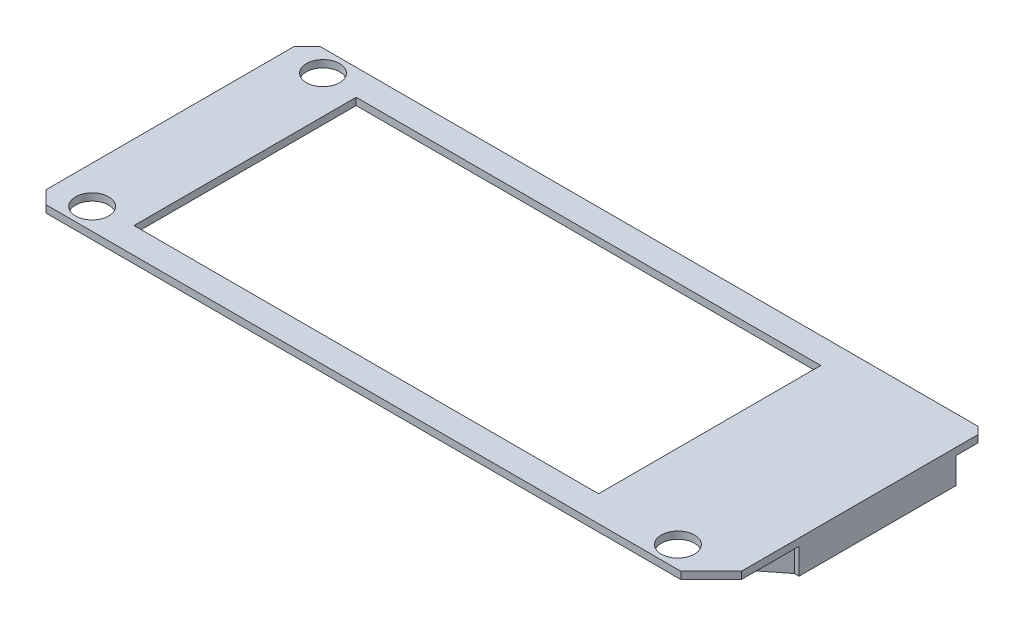
ISO-10303-21;
HEADER;
FILE_DESCRIPTION(('STEP AP214'),'2;1');
FILE_NAME('part.step','',(''),(''),'','','');
FILE_SCHEMA(('AUTOMOTIVE_DESIGN { 1 0 10303 214 1 1 1 1 }'));
ENDSEC;
DATA;
#1=APPLICATION_CONTEXT('core data for automotive mechanical design processes');
#2=APPLICATION_PROTOCOL_DEFINITION('international standard','automotive_design',2000,#1);
#3=PRODUCT_CONTEXT('',#1,'mechanical');
#4=PRODUCT('Part','Part','',(#3));
#5=PRODUCT_RELATED_PRODUCT_CATEGORY('part','',(#4));
#6=PRODUCT_DEFINITION_FORMATION('','',#4);
#7=PRODUCT_DEFINITION_CONTEXT('part definition',#1,'design');
#8=PRODUCT_DEFINITION('design','',#6,#7);
#9=PRODUCT_DEFINITION_SHAPE('','',#8);
#10=(LENGTH_UNIT() NAMED_UNIT(*) SI_UNIT(.MILLI.,.METRE.));
#11=(NAMED_UNIT(*) PLANE_ANGLE_UNIT() SI_UNIT($,.RADIAN.));
#12=(NAMED_UNIT(*) SI_UNIT($,.STERADIAN.) SOLID_ANGLE_UNIT());
#13=UNCERTAINTY_MEASURE_WITH_UNIT(LENGTH_MEASURE(1.E-05),#10,'distance_accuracy_value','');
#14=(GEOMETRIC_REPRESENTATION_CONTEXT(3) GLOBAL_UNCERTAINTY_ASSIGNED_CONTEXT((#13)) GLOBAL_UNIT_ASSIGNED_CONTEXT((#10,
#11,#12)) REPRESENTATION_CONTEXT('',''));
#15=CARTESIAN_POINT('',(0.,0.,0.));
#16=DIRECTION('',(0.,0.,1.));
#17=DIRECTION('',(1.,0.,0.));
#18=AXIS2_PLACEMENT_3D('',#15,#16,#17);
#19=CARTESIAN_POINT('',(17.3158649017874,0.,-2.33980702383453));
#20=DIRECTION('',(0.,1.,0.));
#21=DIRECTION('',(0.,0.,1.));
#22=AXIS2_PLACEMENT_3D('',#19,#20,#21);
#23=PLANE('',#22);
#24=CARTESIAN_POINT('',(-21.0841350982126,0.,-8.3398070238345));
#25=DIRECTION('',(0.,1.,0.));
#26=DIRECTION('',(0.,0.,1.));
#27=AXIS2_PLACEMENT_3D('',#24,#25,#26);
#28=CIRCLE('',#27,1.15);
#29=CARTESIAN_POINT('',(-21.0841350982126,0.,-7.18980702383451));
#30=VERTEX_POINT('',#29);
#31=EDGE_CURVE('E469',#30,#30,#28,.T.);
#32=ORIENTED_EDGE('',*,*,#31,.T.);
#33=EDGE_LOOP('',(#32));
#34=FACE_BOUND('',#33,.T.);
#35=CARTESIAN_POINT('',(-21.0841350982126,0.,7.6601929761655));
#36=DIRECTION('',(0.,1.,0.));
#37=DIRECTION('',(0.,0.,1.));
#38=AXIS2_PLACEMENT_3D('',#35,#36,#37);
#39=CIRCLE('',#38,1.15);
#40=CARTESIAN_POINT('',(-21.0841350982126,0.,8.8101929761655));
#41=VERTEX_POINT('',#40);
#42=EDGE_CURVE('E660',#41,#41,#39,.T.);
#43=ORIENTED_EDGE('',*,*,#42,.T.);
#44=EDGE_LOOP('',(#43));
#45=FACE_BOUND('',#44,.T.);
#46=CARTESIAN_POINT('',(19.5158649017874,0.,7.6601929761655));
#47=DIRECTION('',(0.,1.,0.));
#48=DIRECTION('',(0.,0.,1.));
#49=AXIS2_PLACEMENT_3D('',#46,#47,#48);
#50=CIRCLE('',#49,1.15);
#51=CARTESIAN_POINT('',(19.5158649017874,0.,8.8101929761655));
#52=VERTEX_POINT('',#51);
#53=EDGE_CURVE('E664',#52,#52,#50,.T.);
#54=ORIENTED_EDGE('',*,*,#53,.T.);
#55=EDGE_LOOP('',(#54));
#56=FACE_BOUND('',#55,.T.);
#57=DIRECTION('',(0.,0.,1.));
#58=VECTOR('',#57,1.);
#59=CARTESIAN_POINT('',(-18.4841350982126,0.,-8.0398070238345));
#60=LINE('',#59,#58);
#61=CARTESIAN_POINT('',(-18.4841350982126,0.,-8.0398070238345));
#62=VERTEX_POINT('',#61);
#63=CARTESIAN_POINT('',(-18.4841350982126,0.,7.36019297616549));
#64=VERTEX_POINT('',#63);
#65=EDGE_CURVE('E271',#62,#64,#60,.T.);
#66=ORIENTED_EDGE('',*,*,#65,.T.);
#67=DIRECTION('',(-1.,0.,0.));
#68=VECTOR('',#67,1.);
#69=CARTESIAN_POINT('',(0.,0.,7.36019297616549));
#70=LINE('',#69,#68);
#71=CARTESIAN_POINT('',(13.7158649017874,0.,7.36019297616549));
#72=VERTEX_POINT('',#71);
#73=EDGE_CURVE('E296',#72,#64,#70,.T.);
#74=ORIENTED_EDGE('',*,*,#73,.F.);
#75=DIRECTION('',(0.,0.,-1.));
#76=VECTOR('',#75,1.);
#77=CARTESIAN_POINT('',(13.7158649017874,0.,0.));
#78=LINE('',#77,#76);
#79=CARTESIAN_POINT('',(13.7158649017874,0.,-8.0398070238345));
#80=VERTEX_POINT('',#79);
#81=EDGE_CURVE('E300',#72,#80,#78,.T.);
#82=ORIENTED_EDGE('',*,*,#81,.T.);
#83=DIRECTION('',(-1.,0.,0.));
#84=VECTOR('',#83,1.);
#85=CARTESIAN_POINT('',(0.,0.,-8.0398070238345));
#86=LINE('',#85,#84);
#87=EDGE_CURVE('E287',#80,#62,#86,.T.);
#88=ORIENTED_EDGE('',*,*,#87,.T.);
#89=EDGE_LOOP('',(#66,#74,#82,#88));
#90=FACE_BOUND('',#89,.T.);
#91=DIRECTION('',(-1.,0.,0.));
#92=VECTOR('',#91,1.);
#93=CARTESIAN_POINT('',(23.3158649017874,0.,3.06205646756993));
#94=LINE('',#93,#92);
#95=CARTESIAN_POINT('',(23.3158649017874,0.,3.06205646756993));
#96=VERTEX_POINT('',#95);
#97=CARTESIAN_POINT('',(22.9996878692031,0.,3.06205646756993));
#98=VERTEX_POINT('',#97);
#99=EDGE_CURVE('E432',#96,#98,#94,.T.);
#100=ORIENTED_EDGE('',*,*,#99,.F.);
#101=DIRECTION('',(0.,0.,-1.));
#102=VECTOR('',#101,1.);
#103=CARTESIAN_POINT('',(23.3158649017874,0.,-7.9398070238345));
#104=LINE('',#103,#102);
#105=CARTESIAN_POINT('',(23.3158649017874,0.,7.0601929761655));
#106=VERTEX_POINT('',#105);
#107=EDGE_CURVE('E327',#106,#96,#104,.T.);
#108=ORIENTED_EDGE('',*,*,#107,.F.);
#109=DIRECTION('',(0.707106781186547,0.,-0.707106781186548));
#110=VECTOR('',#109,1.);
#111=CARTESIAN_POINT('',(21.2158649017874,0.,9.16019297616549));
#112=LINE('',#111,#110);
#113=CARTESIAN_POINT('',(21.2158649017874,0.,9.16019297616549));
#114=VERTEX_POINT('',#113);
#115=EDGE_CURVE('E367',#114,#106,#112,.T.);
#116=ORIENTED_EDGE('',*,*,#115,.F.);
#117=DIRECTION('',(1.,0.,0.));
#118=VECTOR('',#117,1.);
#119=CARTESIAN_POINT('',(-22.7841350982126,0.,9.16019297616549));
#120=LINE('',#119,#118);
#121=CARTESIAN_POINT('',(-22.7841350982126,0.,9.16019297616549));
#122=VERTEX_POINT('',#121);
#123=EDGE_CURVE('E364',#122,#114,#120,.T.);
#124=ORIENTED_EDGE('',*,*,#123,.F.);
#125=DIRECTION('',(0.707106781186549,0.,0.707106781186546));
#126=VECTOR('',#125,1.);
#127=CARTESIAN_POINT('',(-23.6841350982126,0.,8.2601929761655));
#128=LINE('',#127,#126);
#129=CARTESIAN_POINT('',(-23.6841350982126,0.,8.2601929761655));
#130=VERTEX_POINT('',#129);
#131=EDGE_CURVE('E361',#130,#122,#128,.T.);
#132=ORIENTED_EDGE('',*,*,#131,.F.);
#133=DIRECTION('',(0.,0.,1.));
#134=VECTOR('',#133,1.);
#135=CARTESIAN_POINT('',(-23.6841350982126,0.,-8.9398070238345));
#136=LINE('',#135,#134);
#137=CARTESIAN_POINT('',(-23.6841350982126,0.,-8.9398070238345));
#138=VERTEX_POINT('',#137);
#139=EDGE_CURVE('E358',#138,#130,#136,.T.);
#140=ORIENTED_EDGE('',*,*,#139,.F.);
#141=DIRECTION('',(-0.707106781186549,0.,0.707106781186545));
#142=VECTOR('',#141,1.);
#143=CARTESIAN_POINT('',(-22.7841350982126,0.,-9.8398070238345));
#144=LINE('',#143,#142);
#145=CARTESIAN_POINT('',(-22.7841350982126,0.,-9.8398070238345));
#146=VERTEX_POINT('',#145);
#147=EDGE_CURVE('E355',#146,#138,#144,.T.);
#148=ORIENTED_EDGE('',*,*,#147,.F.);
#149=DIRECTION('',(-1.,0.,0.));
#150=VECTOR('',#149,1.);
#151=CARTESIAN_POINT('',(22.8158649017874,0.,-9.83980702383451));
#152=LINE('',#151,#150);
#153=CARTESIAN_POINT('',(22.8158649017874,0.,-9.83980702383451));
#154=VERTEX_POINT('',#153);
#155=EDGE_CURVE('E352',#154,#146,#152,.T.);
#156=ORIENTED_EDGE('',*,*,#155,.F.);
#157=DIRECTION('',(-0.707106781186539,0.,-0.707106781186556));
#158=VECTOR('',#157,1.);
#159=CARTESIAN_POINT('',(23.3158649017874,0.,-9.3398070238345));
#160=LINE('',#159,#158);
#161=CARTESIAN_POINT('',(23.3158649017874,0.,-9.3398070238345));
#162=VERTEX_POINT('',#161);
#163=EDGE_CURVE('E318',#162,#154,#160,.T.);
#164=ORIENTED_EDGE('',*,*,#163,.F.);
#165=CARTESIAN_POINT('',(23.3158649017874,0.,-7.82183285091469));
#166=VERTEX_POINT('',#165);
#167=EDGE_CURVE('E371',#166,#162,#104,.T.);
#168=ORIENTED_EDGE('',*,*,#167,.F.);
#169=DIRECTION('',(1.,0.,0.));
#170=VECTOR('',#169,1.);
#171=CARTESIAN_POINT('',(22.9524615456008,0.,-7.82183285091469));
#172=LINE('',#171,#170);
#173=CARTESIAN_POINT('',(22.9524615456008,0.,-7.82183285091469));
#174=VERTEX_POINT('',#173);
#175=EDGE_CURVE('E428',#174,#166,#172,.T.);
#176=ORIENTED_EDGE('',*,*,#175,.F.);
#177=DIRECTION('',(0.771886501575493,0.,0.635760354760776));
#178=VECTOR('',#177,1.);
#179=CARTESIAN_POINT('',(21.5301264029284,0.,-8.99333189002014));
#180=LINE('',#179,#178);
#181=CARTESIAN_POINT('',(21.5301264029284,0.,-8.99333189002014));
#182=VERTEX_POINT('',#181);
#183=EDGE_CURVE('E269',#182,#174,#180,.T.);
#184=ORIENTED_EDGE('',*,*,#183,.F.);
#185=DIRECTION('',(1.,0.,0.));
#186=VECTOR('',#185,1.);
#187=CARTESIAN_POINT('',(19.7180205816291,0.,-8.99333189002014));
#188=LINE('',#187,#186);
#189=CARTESIAN_POINT('',(19.7180205816291,0.,-8.99333189002014));
#190=VERTEX_POINT('',#189);
#191=EDGE_CURVE('E266',#190,#182,#188,.T.);
#192=ORIENTED_EDGE('',*,*,#191,.F.);
#193=DIRECTION('',(0.,0.,-1.));
#194=VECTOR('',#193,1.);
#195=CARTESIAN_POINT('',(19.7180205816291,0.,4.42459913742816));
#196=LINE('',#195,#194);
#197=CARTESIAN_POINT('',(19.7180205816291,0.,4.42459913742816));
#198=VERTEX_POINT('',#197);
#199=EDGE_CURVE('E493',#198,#190,#196,.T.);
#200=ORIENTED_EDGE('',*,*,#199,.F.);
#201=DIRECTION('',(-1.,0.,0.));
#202=VECTOR('',#201,1.);
#203=CARTESIAN_POINT('',(20.0307736130758,0.,4.42459913742816));
#204=LINE('',#203,#202);
#205=CARTESIAN_POINT('',(20.0307736130758,0.,4.42459913742816));
#206=VERTEX_POINT('',#205);
#207=EDGE_CURVE('E489',#206,#198,#204,.T.);
#208=ORIENTED_EDGE('',*,*,#207,.F.);
#209=DIRECTION('',(0.,0.,-1.));
#210=VECTOR('',#209,1.);
#211=CARTESIAN_POINT('',(20.0307736130758,0.,5.41628734671873));
#212=LINE('',#211,#210);
#213=CARTESIAN_POINT('',(20.0307736130758,0.,5.41628734671873));
#214=VERTEX_POINT('',#213);
#215=EDGE_CURVE('E485',#214,#206,#212,.T.);
#216=ORIENTED_EDGE('',*,*,#215,.F.);
#217=DIRECTION('',(-1.,0.,0.));
#218=VECTOR('',#217,1.);
#219=CARTESIAN_POINT('',(21.0247582431746,0.,5.41628734671873));
#220=LINE('',#219,#218);
#221=CARTESIAN_POINT('',(21.0247582431746,0.,5.41628734671873));
#222=VERTEX_POINT('',#221);
#223=EDGE_CURVE('E481',#222,#214,#220,.T.);
#224=ORIENTED_EDGE('',*,*,#223,.F.);
#225=DIRECTION('',(0.,0.,1.));
#226=VECTOR('',#225,1.);
#227=CARTESIAN_POINT('',(21.0247582431746,0.,4.42459913742816));
#228=LINE('',#227,#226);
#229=CARTESIAN_POINT('',(21.0247582431746,0.,4.42459913742816));
#230=VERTEX_POINT('',#229);
#231=EDGE_CURVE('E477',#230,#222,#228,.T.);
#232=ORIENTED_EDGE('',*,*,#231,.F.);
#233=DIRECTION('',(-1.,0.,0.));
#234=VECTOR('',#233,1.);
#235=CARTESIAN_POINT('',(21.2615809906494,0.,4.42459913742816));
#236=LINE('',#235,#234);
#237=CARTESIAN_POINT('',(21.2615809906494,0.,4.42459913742816));
#238=VERTEX_POINT('',#237);
#239=EDGE_CURVE('E104',#238,#230,#236,.T.);
#240=ORIENTED_EDGE('',*,*,#239,.F.);
#241=DIRECTION('',(-0.787002560515835,0.,0.616949730319675));
#242=VECTOR('',#241,1.);
#243=CARTESIAN_POINT('',(22.9996878692031,0.,3.06205646756993));
#244=LINE('',#243,#242);
#245=EDGE_CURVE('E99',#98,#238,#244,.T.);
#246=ORIENTED_EDGE('',*,*,#245,.F.);
#247=EDGE_LOOP('',(#100,#108,#116,#124,#132,#140,#148,#156,#164,#168,#176,#184,#192,#200,#208,
#216,#224,#232,#240,#246));
#248=FACE_BOUND('',#247,.T.);
#249=ADVANCED_FACE('F83',(#34,#45,#56,#90,#248),#23,.F.);
#250=CARTESIAN_POINT('',(17.3158649017874,0.5,-2.33980702383453));
#251=DIRECTION('',(0.,1.,0.));
#252=DIRECTION('',(0.,0.,1.));
#253=AXIS2_PLACEMENT_3D('',#250,#251,#252);
#254=PLANE('',#253);
#255=CARTESIAN_POINT('',(-21.0841350982126,0.5,-8.3398070238345));
#256=DIRECTION('',(0.,1.,0.));
#257=DIRECTION('',(0.,0.,1.));
#258=AXIS2_PLACEMENT_3D('',#255,#256,#257);
#259=CIRCLE('',#258,1.15);
#260=CARTESIAN_POINT('',(-21.0841350982126,0.5,-7.18980702383451));
#261=VERTEX_POINT('',#260);
#262=EDGE_CURVE('E657',#261,#261,#259,.T.);
#263=ORIENTED_EDGE('',*,*,#262,.F.);
#264=EDGE_LOOP('',(#263));
#265=FACE_BOUND('',#264,.T.);
#266=CARTESIAN_POINT('',(-21.0841350982126,0.5,7.6601929761655));
#267=DIRECTION('',(0.,1.,0.));
#268=DIRECTION('',(0.,0.,1.));
#269=AXIS2_PLACEMENT_3D('',#266,#267,#268);
#270=CIRCLE('',#269,1.15);
#271=CARTESIAN_POINT('',(-21.0841350982126,0.5,8.8101929761655));
#272=VERTEX_POINT('',#271);
#273=EDGE_CURVE('E674',#272,#272,#270,.T.);
#274=ORIENTED_EDGE('',*,*,#273,.F.);
#275=EDGE_LOOP('',(#274));
#276=FACE_BOUND('',#275,.T.);
#277=CARTESIAN_POINT('',(19.5158649017874,0.5,7.6601929761655));
#278=DIRECTION('',(0.,1.,0.));
#279=DIRECTION('',(0.,0.,1.));
#280=AXIS2_PLACEMENT_3D('',#277,#278,#279);
#281=CIRCLE('',#280,1.15);
#282=CARTESIAN_POINT('',(19.5158649017874,0.5,8.8101929761655));
#283=VERTEX_POINT('',#282);
#284=EDGE_CURVE('E670',#283,#283,#281,.T.);
#285=ORIENTED_EDGE('',*,*,#284,.F.);
#286=EDGE_LOOP('',(#285));
#287=FACE_BOUND('',#286,.T.);
#288=DIRECTION('',(0.707106781186547,0.,-0.707106781186548));
#289=VECTOR('',#288,1.);
#290=CARTESIAN_POINT('',(21.2158649017874,0.5,9.16019297616549));
#291=LINE('',#290,#289);
#292=CARTESIAN_POINT('',(21.2158649017874,0.5,9.16019297616549));
#293=VERTEX_POINT('',#292);
#294=CARTESIAN_POINT('',(23.3158649017874,0.5,7.0601929761655));
#295=VERTEX_POINT('',#294);
#296=EDGE_CURVE('E342',#293,#295,#291,.T.);
#297=ORIENTED_EDGE('',*,*,#296,.T.);
#298=DIRECTION('',(0.,0.,-1.));
#299=VECTOR('',#298,1.);
#300=CARTESIAN_POINT('',(23.3158649017874,0.5,7.0601929761655));
#301=LINE('',#300,#299);
#302=CARTESIAN_POINT('',(23.3158649017874,0.5,-9.3398070238345));
#303=VERTEX_POINT('',#302);
#304=EDGE_CURVE('E345',#295,#303,#301,.T.);
#305=ORIENTED_EDGE('',*,*,#304,.T.);
#306=DIRECTION('',(-0.707106781186539,0.,-0.707106781186556));
#307=VECTOR('',#306,1.);
#308=CARTESIAN_POINT('',(23.3158649017874,0.5,-9.3398070238345));
#309=LINE('',#308,#307);
#310=CARTESIAN_POINT('',(22.8158649017874,0.5,-9.83980702383451));
#311=VERTEX_POINT('',#310);
#312=EDGE_CURVE('E322',#303,#311,#309,.T.);
#313=ORIENTED_EDGE('',*,*,#312,.T.);
#314=DIRECTION('',(-1.,0.,0.));
#315=VECTOR('',#314,1.);
#316=CARTESIAN_POINT('',(22.8158649017874,0.5,-9.83980702383451));
#317=LINE('',#316,#315);
#318=CARTESIAN_POINT('',(-22.7841350982126,0.5,-9.8398070238345));
#319=VERTEX_POINT('',#318);
#320=EDGE_CURVE('E326',#311,#319,#317,.T.);
#321=ORIENTED_EDGE('',*,*,#320,.T.);
#322=DIRECTION('',(-0.707106781186549,0.,0.707106781186545));
#323=VECTOR('',#322,1.);
#324=CARTESIAN_POINT('',(-22.7841350982126,0.5,-9.8398070238345));
#325=LINE('',#324,#323);
#326=CARTESIAN_POINT('',(-23.6841350982126,0.5,-8.9398070238345));
#327=VERTEX_POINT('',#326);
#328=EDGE_CURVE('E330',#319,#327,#325,.T.);
#329=ORIENTED_EDGE('',*,*,#328,.T.);
#330=DIRECTION('',(0.,0.,1.));
#331=VECTOR('',#330,1.);
#332=CARTESIAN_POINT('',(-23.6841350982126,0.5,-8.9398070238345));
#333=LINE('',#332,#331);
#334=CARTESIAN_POINT('',(-23.6841350982126,0.5,8.2601929761655));
#335=VERTEX_POINT('',#334);
#336=EDGE_CURVE('E333',#327,#335,#333,.T.);
#337=ORIENTED_EDGE('',*,*,#336,.T.);
#338=DIRECTION('',(0.707106781186549,0.,0.707106781186546));
#339=VECTOR('',#338,1.);
#340=CARTESIAN_POINT('',(-23.6841350982126,0.5,8.2601929761655));
#341=LINE('',#340,#339);
#342=CARTESIAN_POINT('',(-22.7841350982126,0.5,9.16019297616549));
#343=VERTEX_POINT('',#342);
#344=EDGE_CURVE('E336',#335,#343,#341,.T.);
#345=ORIENTED_EDGE('',*,*,#344,.T.);
#346=DIRECTION('',(1.,0.,0.));
#347=VECTOR('',#346,1.);
#348=CARTESIAN_POINT('',(-22.7841350982126,0.5,9.16019297616549));
#349=LINE('',#348,#347);
#350=EDGE_CURVE('E339',#343,#293,#349,.T.);
#351=ORIENTED_EDGE('',*,*,#350,.T.);
#352=EDGE_LOOP('',(#297,#305,#313,#321,#329,#337,#345,#351));
#353=FACE_BOUND('',#352,.T.);
#354=DIRECTION('',(-1.,0.,0.));
#355=VECTOR('',#354,1.);
#356=CARTESIAN_POINT('',(0.,0.5,7.36019297616549));
#357=LINE('',#356,#355);
#358=CARTESIAN_POINT('',(13.7158649017874,0.5,7.36019297616549));
#359=VERTEX_POINT('',#358);
#360=CARTESIAN_POINT('',(-18.4841350982126,0.5,7.36019297616549));
#361=VERTEX_POINT('',#360);
#362=EDGE_CURVE('E282',#359,#361,#357,.T.);
#363=ORIENTED_EDGE('',*,*,#362,.T.);
#364=DIRECTION('',(0.,0.,1.));
#365=VECTOR('',#364,1.);
#366=CARTESIAN_POINT('',(-18.4841350982126,0.5,-8.0398070238345));
#367=LINE('',#366,#365);
#368=CARTESIAN_POINT('',(-18.4841350982126,0.5,-8.0398070238345));
#369=VERTEX_POINT('',#368);
#370=EDGE_CURVE('E276',#369,#361,#367,.T.);
#371=ORIENTED_EDGE('',*,*,#370,.F.);
#372=DIRECTION('',(-1.,0.,0.));
#373=VECTOR('',#372,1.);
#374=CARTESIAN_POINT('',(0.,0.5,-8.0398070238345));
#375=LINE('',#374,#373);
#376=CARTESIAN_POINT('',(13.7158649017874,0.5,-8.0398070238345));
#377=VERTEX_POINT('',#376);
#378=EDGE_CURVE('E291',#377,#369,#375,.T.);
#379=ORIENTED_EDGE('',*,*,#378,.F.);
#380=DIRECTION('',(0.,0.,-1.));
#381=VECTOR('',#380,1.);
#382=CARTESIAN_POINT('',(13.7158649017874,0.5,0.));
#383=LINE('',#382,#381);
#384=EDGE_CURVE('E286',#359,#377,#383,.T.);
#385=ORIENTED_EDGE('',*,*,#384,.F.);
#386=EDGE_LOOP('',(#363,#371,#379,#385));
#387=FACE_BOUND('',#386,.T.);
#388=ADVANCED_FACE('F420',(#265,#276,#287,#353,#387),#254,.T.);
#389=CARTESIAN_POINT('',(23.3158649017874,0.5,-9.3398070238345));
#390=DIRECTION('',(-0.707106781186556,0.,0.707106781186539));
#391=DIRECTION('',(0.707106781186539,0.,0.707106781186556));
#392=AXIS2_PLACEMENT_3D('',#389,#390,#391);
#393=PLANE('',#392);
#394=ORIENTED_EDGE('',*,*,#163,.T.);
#395=DIRECTION('',(0.,-1.,0.));
#396=VECTOR('',#395,1.);
#397=CARTESIAN_POINT('',(22.8158649017874,0.5,-9.83980702383451));
#398=LINE('',#397,#396);
#399=EDGE_CURVE('E12',#311,#154,#398,.T.);
#400=ORIENTED_EDGE('',*,*,#399,.F.);
#401=ORIENTED_EDGE('',*,*,#312,.F.);
#402=DIRECTION('',(0.,-1.,0.));
#403=VECTOR('',#402,1.);
#404=CARTESIAN_POINT('',(23.3158649017874,0.5,-9.3398070238345));
#405=LINE('',#404,#403);
#406=EDGE_CURVE('E348',#303,#162,#405,.T.);
#407=ORIENTED_EDGE('',*,*,#406,.T.);
#408=EDGE_LOOP('',(#394,#400,#401,#407));
#409=FACE_BOUND('',#408,.T.);
#410=ADVANCED_FACE('F85',(#409),#393,.F.);
#411=CARTESIAN_POINT('',(22.8158649017874,0.5,-9.83980702383451));
#412=DIRECTION('',(0.,0.,1.));
#413=DIRECTION('',(1.,0.,0.));
#414=AXIS2_PLACEMENT_3D('',#411,#412,#413);
#415=PLANE('',#414);
#416=DIRECTION('',(0.,-1.,0.));
#417=VECTOR('',#416,1.);
#418=CARTESIAN_POINT('',(-22.7841350982126,0.5,-9.8398070238345));
#419=LINE('',#418,#417);
#420=EDGE_CURVE('E92',#319,#146,#419,.T.);
#421=ORIENTED_EDGE('',*,*,#420,.F.);
#422=ORIENTED_EDGE('',*,*,#320,.F.);
#423=ORIENTED_EDGE('',*,*,#399,.T.);
#424=ORIENTED_EDGE('',*,*,#155,.T.);
#425=EDGE_LOOP('',(#421,#422,#423,#424));
#426=FACE_BOUND('',#425,.T.);
#427=ADVANCED_FACE('F425',(#426),#415,.F.);
#428=CARTESIAN_POINT('',(-22.7841350982126,0.5,-9.8398070238345));
#429=DIRECTION('',(0.707106781186546,0.,0.70710678118655));
#430=DIRECTION('',(0.70710678118655,0.,-0.707106781186546));
#431=AXIS2_PLACEMENT_3D('',#428,#429,#430);
#432=PLANE('',#431);
#433=ORIENTED_EDGE('',*,*,#147,.T.);
#434=DIRECTION('',(0.,-1.,0.));
#435=VECTOR('',#434,1.);
#436=CARTESIAN_POINT('',(-23.6841350982126,0.5,-8.9398070238345));
#437=LINE('',#436,#435);
#438=EDGE_CURVE('E394',#327,#138,#437,.T.);
#439=ORIENTED_EDGE('',*,*,#438,.F.);
#440=ORIENTED_EDGE('',*,*,#328,.F.);
#441=ORIENTED_EDGE('',*,*,#420,.T.);
#442=EDGE_LOOP('',(#433,#439,#440,#441));
#443=FACE_BOUND('',#442,.T.);
#444=ADVANCED_FACE('F403',(#443),#432,.F.);
#445=CARTESIAN_POINT('',(-23.6841350982126,0.5,-8.9398070238345));
#446=DIRECTION('',(1.,0.,0.));
#447=DIRECTION('',(0.,0.,-1.));
#448=AXIS2_PLACEMENT_3D('',#445,#446,#447);
#449=PLANE('',#448);
#450=ORIENTED_EDGE('',*,*,#139,.T.);
#451=DIRECTION('',(0.,-1.,0.));
#452=VECTOR('',#451,1.);
#453=CARTESIAN_POINT('',(-23.6841350982126,0.5,8.2601929761655));
#454=LINE('',#453,#452);
#455=EDGE_CURVE('E390',#335,#130,#454,.T.);
#456=ORIENTED_EDGE('',*,*,#455,.F.);
#457=ORIENTED_EDGE('',*,*,#336,.F.);
#458=ORIENTED_EDGE('',*,*,#438,.T.);
#459=EDGE_LOOP('',(#450,#456,#457,#458));
#460=FACE_BOUND('',#459,.T.);
#461=ADVANCED_FACE('F412',(#460),#449,.F.);
#462=CARTESIAN_POINT('',(-23.6841350982126,0.5,8.2601929761655));
#463=DIRECTION('',(0.707106781186546,0.,-0.707106781186549));
#464=DIRECTION('',(-0.707106781186549,0.,-0.707106781186546));
#465=AXIS2_PLACEMENT_3D('',#462,#463,#464);
#466=PLANE('',#465);
#467=ORIENTED_EDGE('',*,*,#131,.T.);
#468=DIRECTION('',(0.,-1.,0.));
#469=VECTOR('',#468,1.);
#470=CARTESIAN_POINT('',(-22.7841350982126,0.5,9.16019297616549));
#471=LINE('',#470,#469);
#472=EDGE_CURVE('E386',#343,#122,#471,.T.);
#473=ORIENTED_EDGE('',*,*,#472,.F.);
#474=ORIENTED_EDGE('',*,*,#344,.F.);
#475=ORIENTED_EDGE('',*,*,#455,.T.);
#476=EDGE_LOOP('',(#467,#473,#474,#475));
#477=FACE_BOUND('',#476,.T.);
#478=ADVANCED_FACE('F416',(#477),#466,.F.);
#479=CARTESIAN_POINT('',(-22.7841350982126,0.5,9.16019297616549));
#480=DIRECTION('',(0.,0.,-1.));
#481=DIRECTION('',(-1.,0.,0.));
#482=AXIS2_PLACEMENT_3D('',#479,#480,#481);
#483=PLANE('',#482);
#484=ORIENTED_EDGE('',*,*,#123,.T.);
#485=DIRECTION('',(0.,-1.,0.));
#486=VECTOR('',#485,1.);
#487=CARTESIAN_POINT('',(21.2158649017874,0.5,9.16019297616549));
#488=LINE('',#487,#486);
#489=EDGE_CURVE('E382',#293,#114,#488,.T.);
#490=ORIENTED_EDGE('',*,*,#489,.F.);
#491=ORIENTED_EDGE('',*,*,#350,.F.);
#492=ORIENTED_EDGE('',*,*,#472,.T.);
#493=EDGE_LOOP('',(#484,#490,#491,#492));
#494=FACE_BOUND('',#493,.T.);
#495=ADVANCED_FACE('F594',(#494),#483,.F.);
#496=CARTESIAN_POINT('',(21.2158649017874,0.5,9.16019297616549));
#497=DIRECTION('',(-0.707106781186548,0.,-0.707106781186547));
#498=DIRECTION('',(-0.707106781186547,0.,0.707106781186548));
#499=AXIS2_PLACEMENT_3D('',#496,#497,#498);
#500=PLANE('',#499);
#501=ORIENTED_EDGE('',*,*,#115,.T.);
#502=DIRECTION('',(0.,-1.,0.));
#503=VECTOR('',#502,1.);
#504=CARTESIAN_POINT('',(23.3158649017874,0.5,7.0601929761655));
#505=LINE('',#504,#503);
#506=EDGE_CURVE('E378',#295,#106,#505,.T.);
#507=ORIENTED_EDGE('',*,*,#506,.F.);
#508=ORIENTED_EDGE('',*,*,#296,.F.);
#509=ORIENTED_EDGE('',*,*,#489,.T.);
#510=EDGE_LOOP('',(#501,#507,#508,#509));
#511=FACE_BOUND('',#510,.T.);
#512=ADVANCED_FACE('F591',(#511),#500,.F.);
#513=CARTESIAN_POINT('',(23.3158649017874,0.5,-7.9398070238345));
#514=DIRECTION('',(-1.,0.,0.));
#515=DIRECTION('',(0.,0.,1.));
#516=AXIS2_PLACEMENT_3D('',#513,#514,#515);
#517=PLANE('',#516);
#518=ORIENTED_EDGE('',*,*,#107,.T.);
#519=DIRECTION('',(0.,1.,0.));
#520=VECTOR('',#519,1.);
#521=CARTESIAN_POINT('',(23.3158649017874,-1.8,3.06205646756993));
#522=LINE('',#521,#520);
#523=CARTESIAN_POINT('',(23.3158649017874,-1.8,3.06205646756993));
#524=VERTEX_POINT('',#523);
#525=EDGE_CURVE('E278',#524,#96,#522,.T.);
#526=ORIENTED_EDGE('',*,*,#525,.F.);
#527=DIRECTION('',(0.,0.,1.));
#528=VECTOR('',#527,1.);
#529=CARTESIAN_POINT('',(23.3158649017874,-1.8,-7.82183285091469));
#530=LINE('',#529,#528);
#531=CARTESIAN_POINT('',(23.3158649017874,-1.8,-7.82183285091469));
#532=VERTEX_POINT('',#531);
#533=EDGE_CURVE('E255',#532,#524,#530,.T.);
#534=ORIENTED_EDGE('',*,*,#533,.F.);
#535=DIRECTION('',(0.,1.,0.));
#536=VECTOR('',#535,1.);
#537=CARTESIAN_POINT('',(23.3158649017874,-1.8,-7.82183285091469));
#538=LINE('',#537,#536);
#539=EDGE_CURVE('E251',#532,#166,#538,.T.);
#540=ORIENTED_EDGE('',*,*,#539,.T.);
#541=ORIENTED_EDGE('',*,*,#167,.T.);
#542=ORIENTED_EDGE('',*,*,#406,.F.);
#543=ORIENTED_EDGE('',*,*,#304,.F.);
#544=ORIENTED_EDGE('',*,*,#506,.T.);
#545=EDGE_LOOP('',(#518,#526,#534,#540,#541,#542,#543,#544));
#546=FACE_BOUND('',#545,.T.);
#547=ADVANCED_FACE('F434',(#546),#517,.F.);
#548=CARTESIAN_POINT('',(0.,0.5,-8.0398070238345));
#549=DIRECTION('',(0.,0.,1.));
#550=DIRECTION('',(1.,0.,0.));
#551=AXIS2_PLACEMENT_3D('',#548,#549,#550);
#552=PLANE('',#551);
#553=DIRECTION('',(0.,1.,0.));
#554=VECTOR('',#553,1.);
#555=CARTESIAN_POINT('',(-18.4841350982126,0.5,-8.0398070238345));
#556=LINE('',#555,#554);
#557=EDGE_CURVE('E310',#62,#369,#556,.T.);
#558=ORIENTED_EDGE('',*,*,#557,.F.);
#559=ORIENTED_EDGE('',*,*,#87,.F.);
#560=DIRECTION('',(0.,-1.,0.));
#561=VECTOR('',#560,1.);
#562=CARTESIAN_POINT('',(13.7158649017874,0.5,-8.0398070238345));
#563=LINE('',#562,#561);
#564=EDGE_CURVE('E307',#377,#80,#563,.T.);
#565=ORIENTED_EDGE('',*,*,#564,.F.);
#566=ORIENTED_EDGE('',*,*,#378,.T.);
#567=EDGE_LOOP('',(#558,#559,#565,#566));
#568=FACE_BOUND('',#567,.T.);
#569=ADVANCED_FACE('F590',(#568),#552,.T.);
#570=CARTESIAN_POINT('',(13.7158649017874,0.5,0.));
#571=DIRECTION('',(-1.,0.,0.));
#572=DIRECTION('',(0.,0.,1.));
#573=AXIS2_PLACEMENT_3D('',#570,#571,#572);
#574=PLANE('',#573);
#575=ORIENTED_EDGE('',*,*,#81,.F.);
#576=DIRECTION('',(0.,-1.,0.));
#577=VECTOR('',#576,1.);
#578=CARTESIAN_POINT('',(13.7158649017874,0.5,7.36019297616549));
#579=LINE('',#578,#577);
#580=EDGE_CURVE('E311',#359,#72,#579,.T.);
#581=ORIENTED_EDGE('',*,*,#580,.F.);
#582=ORIENTED_EDGE('',*,*,#384,.T.);
#583=ORIENTED_EDGE('',*,*,#564,.T.);
#584=EDGE_LOOP('',(#575,#581,#582,#583));
#585=FACE_BOUND('',#584,.T.);
#586=ADVANCED_FACE('F698',(#585),#574,.T.);
#587=CARTESIAN_POINT('',(0.,0.5,7.36019297616549));
#588=DIRECTION('',(0.,0.,1.));
#589=DIRECTION('',(1.,0.,0.));
#590=AXIS2_PLACEMENT_3D('',#587,#588,#589);
#591=PLANE('',#590);
#592=ORIENTED_EDGE('',*,*,#73,.T.);
#593=DIRECTION('',(0.,-1.,0.));
#594=VECTOR('',#593,1.);
#595=CARTESIAN_POINT('',(-18.4841350982126,0.5,7.36019297616549));
#596=LINE('',#595,#594);
#597=EDGE_CURVE('E295',#361,#64,#596,.T.);
#598=ORIENTED_EDGE('',*,*,#597,.F.);
#599=ORIENTED_EDGE('',*,*,#362,.F.);
#600=ORIENTED_EDGE('',*,*,#580,.T.);
#601=EDGE_LOOP('',(#592,#598,#599,#600));
#602=FACE_BOUND('',#601,.T.);
#603=ADVANCED_FACE('F694',(#602),#591,.F.);
#604=CARTESIAN_POINT('',(-18.4841350982126,0.5,-8.0398070238345));
#605=DIRECTION('',(1.,0.,0.));
#606=DIRECTION('',(0.,0.,-1.));
#607=AXIS2_PLACEMENT_3D('',#604,#605,#606);
#608=PLANE('',#607);
#609=ORIENTED_EDGE('',*,*,#597,.T.);
#610=ORIENTED_EDGE('',*,*,#65,.F.);
#611=ORIENTED_EDGE('',*,*,#557,.T.);
#612=ORIENTED_EDGE('',*,*,#370,.T.);
#613=EDGE_LOOP('',(#609,#610,#611,#612));
#614=FACE_BOUND('',#613,.T.);
#615=ADVANCED_FACE('F702',(#614),#608,.T.);
#616=CARTESIAN_POINT('',(21.5301264029284,-1.8,-8.99333189002014));
#617=DIRECTION('',(-0.635760354760776,0.,0.771886501575493));
#618=DIRECTION('',(0.771886501575493,0.,0.635760354760776));
#619=AXIS2_PLACEMENT_3D('',#616,#617,#618);
#620=PLANE('',#619);
#621=ORIENTED_EDGE('',*,*,#183,.T.);
#622=DIRECTION('',(0.,1.,0.));
#623=VECTOR('',#622,1.);
#624=CARTESIAN_POINT('',(22.9524615456008,-1.8,-7.82183285091469));
#625=LINE('',#624,#623);
#626=CARTESIAN_POINT('',(22.9524615456008,-1.8,-7.82183285091469));
#627=VERTEX_POINT('',#626);
#628=EDGE_CURVE('E248',#627,#174,#625,.T.);
#629=ORIENTED_EDGE('',*,*,#628,.F.);
#630=DIRECTION('',(0.771886501575493,0.,0.635760354760776));
#631=VECTOR('',#630,1.);
#632=CARTESIAN_POINT('',(21.5301264029284,-1.8,-8.99333189002014));
#633=LINE('',#632,#631);
#634=CARTESIAN_POINT('',(21.5301264029284,-1.8,-8.99333189002014));
#635=VERTEX_POINT('',#634);
#636=EDGE_CURVE('E256',#635,#627,#633,.T.);
#637=ORIENTED_EDGE('',*,*,#636,.F.);
#638=DIRECTION('',(0.,1.,0.));
#639=VECTOR('',#638,1.);
#640=CARTESIAN_POINT('',(21.5301264029284,-1.8,-8.99333189002014));
#641=LINE('',#640,#639);
#642=EDGE_CURVE('E467',#635,#182,#641,.T.);
#643=ORIENTED_EDGE('',*,*,#642,.T.);
#644=EDGE_LOOP('',(#621,#629,#637,#643));
#645=FACE_BOUND('',#644,.T.);
#646=ADVANCED_FACE('F268',(#645),#620,.F.);
#647=CARTESIAN_POINT('',(22.9524615456008,-1.8,-7.82183285091469));
#648=DIRECTION('',(0.,0.,1.));
#649=DIRECTION('',(1.,0.,0.));
#650=AXIS2_PLACEMENT_3D('',#647,#648,#649);
#651=PLANE('',#650);
#652=ORIENTED_EDGE('',*,*,#175,.T.);
#653=ORIENTED_EDGE('',*,*,#539,.F.);
#654=DIRECTION('',(1.,0.,0.));
#655=VECTOR('',#654,1.);
#656=CARTESIAN_POINT('',(22.9524615456008,-1.8,-7.82183285091469));
#657=LINE('',#656,#655);
#658=EDGE_CURVE('E243',#627,#532,#657,.T.);
#659=ORIENTED_EDGE('',*,*,#658,.F.);
#660=ORIENTED_EDGE('',*,*,#628,.T.);
#661=EDGE_LOOP('',(#652,#653,#659,#660));
#662=FACE_BOUND('',#661,.T.);
#663=ADVANCED_FACE('F246',(#662),#651,.F.);
#664=CARTESIAN_POINT('',(23.3158649017874,-1.8,3.06205646756993));
#665=DIRECTION('',(0.,0.,-1.));
#666=DIRECTION('',(-1.,0.,0.));
#667=AXIS2_PLACEMENT_3D('',#664,#665,#666);
#668=PLANE('',#667);
#669=ORIENTED_EDGE('',*,*,#99,.T.);
#670=DIRECTION('',(0.,1.,0.));
#671=VECTOR('',#670,1.);
#672=CARTESIAN_POINT('',(22.9996878692031,-1.8,3.06205646756993));
#673=LINE('',#672,#671);
#674=CARTESIAN_POINT('',(22.9996878692031,-1.8,3.06205646756993));
#675=VERTEX_POINT('',#674);
#676=EDGE_CURVE('E530',#675,#98,#673,.T.);
#677=ORIENTED_EDGE('',*,*,#676,.F.);
#678=DIRECTION('',(-1.,0.,0.));
#679=VECTOR('',#678,1.);
#680=CARTESIAN_POINT('',(23.3158649017874,-1.8,3.06205646756993));
#681=LINE('',#680,#679);
#682=EDGE_CURVE('E439',#524,#675,#681,.T.);
#683=ORIENTED_EDGE('',*,*,#682,.F.);
#684=ORIENTED_EDGE('',*,*,#525,.T.);
#685=EDGE_LOOP('',(#669,#677,#683,#684));
#686=FACE_BOUND('',#685,.T.);
#687=ADVANCED_FACE('F535',(#686),#668,.F.);
#688=CARTESIAN_POINT('',(22.9996878692031,-1.8,3.06205646756993));
#689=DIRECTION('',(-0.616949730319675,0.,-0.787002560515835));
#690=DIRECTION('',(-0.787002560515835,0.,0.616949730319675));
#691=AXIS2_PLACEMENT_3D('',#688,#689,#690);
#692=PLANE('',#691);
#693=ORIENTED_EDGE('',*,*,#245,.T.);
#694=DIRECTION('',(0.,1.,0.));
#695=VECTOR('',#694,1.);
#696=CARTESIAN_POINT('',(21.2615809906494,-1.8,4.42459913742816));
#697=LINE('',#696,#695);
#698=CARTESIAN_POINT('',(21.2615809906494,-1.8,4.42459913742816));
#699=VERTEX_POINT('',#698);
#700=EDGE_CURVE('E526',#699,#238,#697,.T.);
#701=ORIENTED_EDGE('',*,*,#700,.F.);
#702=DIRECTION('',(-0.787002560515835,0.,0.616949730319675));
#703=VECTOR('',#702,1.);
#704=CARTESIAN_POINT('',(22.9996878692031,-1.8,3.06205646756993));
#705=LINE('',#704,#703);
#706=EDGE_CURVE('E442',#675,#699,#705,.T.);
#707=ORIENTED_EDGE('',*,*,#706,.F.);
#708=ORIENTED_EDGE('',*,*,#676,.T.);
#709=EDGE_LOOP('',(#693,#701,#707,#708));
#710=FACE_BOUND('',#709,.T.);
#711=ADVANCED_FACE('F542',(#710),#692,.F.);
#712=CARTESIAN_POINT('',(21.2615809906494,-1.8,4.42459913742816));
#713=DIRECTION('',(0.,0.,-1.));
#714=DIRECTION('',(-1.,0.,0.));
#715=AXIS2_PLACEMENT_3D('',#712,#713,#714);
#716=PLANE('',#715);
#717=ORIENTED_EDGE('',*,*,#239,.T.);
#718=DIRECTION('',(0.,1.,0.));
#719=VECTOR('',#718,1.);
#720=CARTESIAN_POINT('',(21.0247582431746,-1.8,4.42459913742816));
#721=LINE('',#720,#719);
#722=CARTESIAN_POINT('',(21.0247582431746,-1.8,4.42459913742816));
#723=VERTEX_POINT('',#722);
#724=EDGE_CURVE('E522',#723,#230,#721,.T.);
#725=ORIENTED_EDGE('',*,*,#724,.F.);
#726=DIRECTION('',(-1.,0.,0.));
#727=VECTOR('',#726,1.);
#728=CARTESIAN_POINT('',(21.2615809906494,-1.8,4.42459913742816));
#729=LINE('',#728,#727);
#730=EDGE_CURVE('E447',#699,#723,#729,.T.);
#731=ORIENTED_EDGE('',*,*,#730,.F.);
#732=ORIENTED_EDGE('',*,*,#700,.T.);
#733=EDGE_LOOP('',(#717,#725,#731,#732));
#734=FACE_BOUND('',#733,.T.);
#735=ADVANCED_FACE('F544',(#734),#716,.F.);
#736=CARTESIAN_POINT('',(21.0247582431746,-1.8,4.42459913742816));
#737=DIRECTION('',(-1.,0.,0.));
#738=DIRECTION('',(0.,0.,1.));
#739=AXIS2_PLACEMENT_3D('',#736,#737,#738);
#740=PLANE('',#739);
#741=ORIENTED_EDGE('',*,*,#231,.T.);
#742=DIRECTION('',(0.,1.,0.));
#743=VECTOR('',#742,1.);
#744=CARTESIAN_POINT('',(21.0247582431746,-1.8,5.41628734671873));
#745=LINE('',#744,#743);
#746=CARTESIAN_POINT('',(21.0247582431746,-1.8,5.41628734671873));
#747=VERTEX_POINT('',#746);
#748=EDGE_CURVE('E518',#747,#222,#745,.T.);
#749=ORIENTED_EDGE('',*,*,#748,.F.);
#750=DIRECTION('',(0.,0.,1.));
#751=VECTOR('',#750,1.);
#752=CARTESIAN_POINT('',(21.0247582431746,-1.8,4.42459913742816));
#753=LINE('',#752,#751);
#754=EDGE_CURVE('E450',#723,#747,#753,.T.);
#755=ORIENTED_EDGE('',*,*,#754,.F.);
#756=ORIENTED_EDGE('',*,*,#724,.T.);
#757=EDGE_LOOP('',(#741,#749,#755,#756));
#758=FACE_BOUND('',#757,.T.);
#759=ADVANCED_FACE('F548',(#758),#740,.F.);
#760=CARTESIAN_POINT('',(21.0247582431746,-1.8,5.41628734671873));
#761=DIRECTION('',(0.,0.,-1.));
#762=DIRECTION('',(-1.,0.,0.));
#763=AXIS2_PLACEMENT_3D('',#760,#761,#762);
#764=PLANE('',#763);
#765=ORIENTED_EDGE('',*,*,#223,.T.);
#766=DIRECTION('',(0.,1.,0.));
#767=VECTOR('',#766,1.);
#768=CARTESIAN_POINT('',(20.0307736130758,-1.8,5.41628734671873));
#769=LINE('',#768,#767);
#770=CARTESIAN_POINT('',(20.0307736130758,-1.8,5.41628734671873));
#771=VERTEX_POINT('',#770);
#772=EDGE_CURVE('E514',#771,#214,#769,.T.);
#773=ORIENTED_EDGE('',*,*,#772,.F.);
#774=DIRECTION('',(-1.,0.,0.));
#775=VECTOR('',#774,1.);
#776=CARTESIAN_POINT('',(21.0247582431746,-1.8,5.41628734671873));
#777=LINE('',#776,#775);
#778=EDGE_CURVE('E453',#747,#771,#777,.T.);
#779=ORIENTED_EDGE('',*,*,#778,.F.);
#780=ORIENTED_EDGE('',*,*,#748,.T.);
#781=EDGE_LOOP('',(#765,#773,#779,#780));
#782=FACE_BOUND('',#781,.T.);
#783=ADVANCED_FACE('F554',(#782),#764,.F.);
#784=CARTESIAN_POINT('',(20.0307736130758,-1.8,5.41628734671873));
#785=DIRECTION('',(1.,0.,0.));
#786=DIRECTION('',(0.,0.,-1.));
#787=AXIS2_PLACEMENT_3D('',#784,#785,#786);
#788=PLANE('',#787);
#789=ORIENTED_EDGE('',*,*,#215,.T.);
#790=DIRECTION('',(0.,1.,0.));
#791=VECTOR('',#790,1.);
#792=CARTESIAN_POINT('',(20.0307736130758,-1.8,4.42459913742816));
#793=LINE('',#792,#791);
#794=CARTESIAN_POINT('',(20.0307736130758,-1.8,4.42459913742816));
#795=VERTEX_POINT('',#794);
#796=EDGE_CURVE('E510',#795,#206,#793,.T.);
#797=ORIENTED_EDGE('',*,*,#796,.F.);
#798=DIRECTION('',(0.,0.,-1.));
#799=VECTOR('',#798,1.);
#800=CARTESIAN_POINT('',(20.0307736130758,-1.8,5.41628734671873));
#801=LINE('',#800,#799);
#802=EDGE_CURVE('E456',#771,#795,#801,.T.);
#803=ORIENTED_EDGE('',*,*,#802,.F.);
#804=ORIENTED_EDGE('',*,*,#772,.T.);
#805=EDGE_LOOP('',(#789,#797,#803,#804));
#806=FACE_BOUND('',#805,.T.);
#807=ADVANCED_FACE('F556',(#806),#788,.F.);
#808=CARTESIAN_POINT('',(20.0307736130758,-1.8,4.42459913742816));
#809=DIRECTION('',(0.,0.,-1.));
#810=DIRECTION('',(-1.,0.,0.));
#811=AXIS2_PLACEMENT_3D('',#808,#809,#810);
#812=PLANE('',#811);
#813=ORIENTED_EDGE('',*,*,#207,.T.);
#814=DIRECTION('',(0.,1.,0.));
#815=VECTOR('',#814,1.);
#816=CARTESIAN_POINT('',(19.7180205816291,-1.8,4.42459913742816));
#817=LINE('',#816,#815);
#818=CARTESIAN_POINT('',(19.7180205816291,-1.8,4.42459913742816));
#819=VERTEX_POINT('',#818);
#820=EDGE_CURVE('E506',#819,#198,#817,.T.);
#821=ORIENTED_EDGE('',*,*,#820,.F.);
#822=DIRECTION('',(-1.,0.,0.));
#823=VECTOR('',#822,1.);
#824=CARTESIAN_POINT('',(20.0307736130758,-1.8,4.42459913742816));
#825=LINE('',#824,#823);
#826=EDGE_CURVE('E459',#795,#819,#825,.T.);
#827=ORIENTED_EDGE('',*,*,#826,.F.);
#828=ORIENTED_EDGE('',*,*,#796,.T.);
#829=EDGE_LOOP('',(#813,#821,#827,#828));
#830=FACE_BOUND('',#829,.T.);
#831=ADVANCED_FACE('F560',(#830),#812,.F.);
#832=CARTESIAN_POINT('',(19.7180205816291,-1.8,4.42459913742816));
#833=DIRECTION('',(1.,0.,0.));
#834=DIRECTION('',(0.,0.,-1.));
#835=AXIS2_PLACEMENT_3D('',#832,#833,#834);
#836=PLANE('',#835);
#837=ORIENTED_EDGE('',*,*,#199,.T.);
#838=DIRECTION('',(0.,1.,0.));
#839=VECTOR('',#838,1.);
#840=CARTESIAN_POINT('',(19.7180205816291,-1.8,-8.99333189002014));
#841=LINE('',#840,#839);
#842=CARTESIAN_POINT('',(19.7180205816291,-1.8,-8.99333189002014));
#843=VERTEX_POINT('',#842);
#844=EDGE_CURVE('E502',#843,#190,#841,.T.);
#845=ORIENTED_EDGE('',*,*,#844,.F.);
#846=DIRECTION('',(0.,0.,-1.));
#847=VECTOR('',#846,1.);
#848=CARTESIAN_POINT('',(19.7180205816291,-1.8,4.42459913742816));
#849=LINE('',#848,#847);
#850=EDGE_CURVE('E462',#819,#843,#849,.T.);
#851=ORIENTED_EDGE('',*,*,#850,.F.);
#852=ORIENTED_EDGE('',*,*,#820,.T.);
#853=EDGE_LOOP('',(#837,#845,#851,#852));
#854=FACE_BOUND('',#853,.T.);
#855=ADVANCED_FACE('F564',(#854),#836,.F.);
#856=CARTESIAN_POINT('',(19.7180205816291,-1.8,-8.99333189002014));
#857=DIRECTION('',(0.,0.,1.));
#858=DIRECTION('',(1.,0.,0.));
#859=AXIS2_PLACEMENT_3D('',#856,#857,#858);
#860=PLANE('',#859);
#861=ORIENTED_EDGE('',*,*,#191,.T.);
#862=ORIENTED_EDGE('',*,*,#642,.F.);
#863=DIRECTION('',(1.,0.,0.));
#864=VECTOR('',#863,1.);
#865=CARTESIAN_POINT('',(19.7180205816291,-1.8,-8.99333189002014));
#866=LINE('',#865,#864);
#867=EDGE_CURVE('E261',#843,#635,#866,.T.);
#868=ORIENTED_EDGE('',*,*,#867,.F.);
#869=ORIENTED_EDGE('',*,*,#844,.T.);
#870=EDGE_LOOP('',(#861,#862,#868,#869));
#871=FACE_BOUND('',#870,.T.);
#872=ADVANCED_FACE('F566',(#871),#860,.F.);
#873=CARTESIAN_POINT('',(0.,-1.8,0.));
#874=DIRECTION('',(0.,-1.,0.));
#875=DIRECTION('',(0.,0.,-1.));
#876=AXIS2_PLACEMENT_3D('',#873,#874,#875);
#877=PLANE('',#876);
#878=ORIENTED_EDGE('',*,*,#636,.T.);
#879=ORIENTED_EDGE('',*,*,#658,.T.);
#880=ORIENTED_EDGE('',*,*,#533,.T.);
#881=ORIENTED_EDGE('',*,*,#682,.T.);
#882=ORIENTED_EDGE('',*,*,#706,.T.);
#883=ORIENTED_EDGE('',*,*,#730,.T.);
#884=ORIENTED_EDGE('',*,*,#754,.T.);
#885=ORIENTED_EDGE('',*,*,#778,.T.);
#886=ORIENTED_EDGE('',*,*,#802,.T.);
#887=ORIENTED_EDGE('',*,*,#826,.T.);
#888=ORIENTED_EDGE('',*,*,#850,.T.);
#889=ORIENTED_EDGE('',*,*,#867,.T.);
#890=EDGE_LOOP('',(#878,#879,#880,#881,#882,#883,#884,#885,#886,#887,#888,#889));
#891=FACE_BOUND('',#890,.T.);
#892=ADVANCED_FACE('F259',(#891),#877,.T.);
#893=CARTESIAN_POINT('',(19.5158649017874,-9.5,7.6601929761655));
#894=DIRECTION('',(0.,1.,0.));
#895=DIRECTION('',(0.,0.,1.));
#896=AXIS2_PLACEMENT_3D('',#893,#894,#895);
#897=CYLINDRICAL_SURFACE('',#896,1.15);
#898=ORIENTED_EDGE('',*,*,#284,.T.);
#899=EDGE_LOOP('',(#898));
#900=FACE_BOUND('',#899,.T.);
#901=ORIENTED_EDGE('',*,*,#53,.F.);
#902=EDGE_LOOP('',(#901));
#903=FACE_BOUND('',#902,.T.);
#904=ADVANCED_FACE('F573',(#900,#903),#897,.F.);
#905=CARTESIAN_POINT('',(-21.0841350982126,-9.5,7.6601929761655));
#906=DIRECTION('',(0.,1.,0.));
#907=DIRECTION('',(0.,0.,1.));
#908=AXIS2_PLACEMENT_3D('',#905,#906,#907);
#909=CYLINDRICAL_SURFACE('',#908,1.15);
#910=ORIENTED_EDGE('',*,*,#273,.T.);
#911=EDGE_LOOP('',(#910));
#912=FACE_BOUND('',#911,.T.);
#913=ORIENTED_EDGE('',*,*,#42,.F.);
#914=EDGE_LOOP('',(#913));
#915=FACE_BOUND('',#914,.T.);
#916=ADVANCED_FACE('F629',(#912,#915),#909,.F.);
#917=CARTESIAN_POINT('',(-21.0841350982126,-9.5,-8.3398070238345));
#918=DIRECTION('',(0.,1.,0.));
#919=DIRECTION('',(0.,0.,1.));
#920=AXIS2_PLACEMENT_3D('',#917,#918,#919);
#921=CYLINDRICAL_SURFACE('',#920,1.15);
#922=ORIENTED_EDGE('',*,*,#262,.T.);
#923=EDGE_LOOP('',(#922));
#924=FACE_BOUND('',#923,.T.);
#925=ORIENTED_EDGE('',*,*,#31,.F.);
#926=EDGE_LOOP('',(#925));
#927=FACE_BOUND('',#926,.T.);
#928=ADVANCED_FACE('F640',(#924,#927),#921,.F.);
#929=CLOSED_SHELL('',(#249,#388,#410,#427,#444,#461,#478,#495,#512,#547,#569,#586,#603,#615,
#646,#663,#687,#711,#735,#759,#783,#807,#831,#855,#872,#892,#904,#916,#928));
#930=MANIFOLD_SOLID_BREP('B2',#929);
#931=ADVANCED_BREP_SHAPE_REPRESENTATION('',(#18,#930),#14);
#932=SHAPE_DEFINITION_REPRESENTATION(#9,#931);
ENDSEC;
END-ISO-10303-21;
